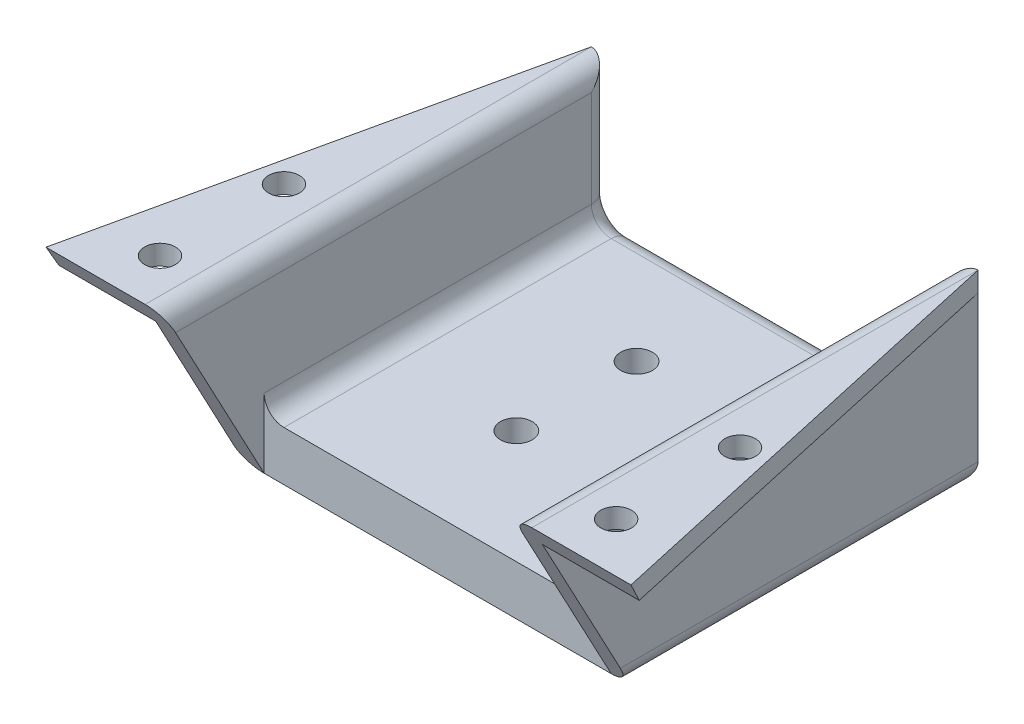
ISO-10303-21;
HEADER;
FILE_DESCRIPTION(('STEP AP214'),'2;1');
FILE_NAME('part.step','',(''),(''),'','','');
FILE_SCHEMA(('AUTOMOTIVE_DESIGN { 1 0 10303 214 1 1 1 1 }'));
ENDSEC;
DATA;
#1=APPLICATION_CONTEXT('core data for automotive mechanical design processes');
#2=APPLICATION_PROTOCOL_DEFINITION('international standard','automotive_design',2000,#1);
#3=PRODUCT_CONTEXT('',#1,'mechanical');
#4=PRODUCT('Part','Part','',(#3));
#5=PRODUCT_RELATED_PRODUCT_CATEGORY('part','',(#4));
#6=PRODUCT_DEFINITION_FORMATION('','',#4);
#7=PRODUCT_DEFINITION_CONTEXT('part definition',#1,'design');
#8=PRODUCT_DEFINITION('design','',#6,#7);
#9=PRODUCT_DEFINITION_SHAPE('','',#8);
#10=(LENGTH_UNIT() NAMED_UNIT(*) SI_UNIT(.MILLI.,.METRE.));
#11=(NAMED_UNIT(*) PLANE_ANGLE_UNIT() SI_UNIT($,.RADIAN.));
#12=(NAMED_UNIT(*) SI_UNIT($,.STERADIAN.) SOLID_ANGLE_UNIT());
#13=UNCERTAINTY_MEASURE_WITH_UNIT(LENGTH_MEASURE(1.E-05),#10,'distance_accuracy_value','');
#14=(GEOMETRIC_REPRESENTATION_CONTEXT(3) GLOBAL_UNCERTAINTY_ASSIGNED_CONTEXT((#13)) GLOBAL_UNIT_ASSIGNED_CONTEXT((#10,
#11,#12)) REPRESENTATION_CONTEXT('',''));
#15=CARTESIAN_POINT('',(0.,0.,0.));
#16=DIRECTION('',(0.,0.,1.));
#17=DIRECTION('',(1.,0.,0.));
#18=AXIS2_PLACEMENT_3D('',#15,#16,#17);
#19=CARTESIAN_POINT('',(-17.5,5.,-17.5));
#20=DIRECTION('',(0.,0.,1.));
#21=DIRECTION('',(1.,0.,0.));
#22=AXIS2_PLACEMENT_3D('',#19,#20,#21);
#23=PLANE('',#22);
#24=CARTESIAN_POINT('',(-15.5,7.,-17.5));
#25=DIRECTION('',(0.,0.,1.));
#26=DIRECTION('',(1.,0.,0.));
#27=AXIS2_PLACEMENT_3D('',#24,#25,#26);
#28=CIRCLE('',#27,4.);
#29=CARTESIAN_POINT('',(-15.5,3.,-17.5));
#30=VERTEX_POINT('',#29);
#31=CARTESIAN_POINT('',(-19.5,7.,-17.5));
#32=VERTEX_POINT('',#31);
#33=EDGE_CURVE('E250',#30,#32,#28,.F.);
#34=ORIENTED_EDGE('',*,*,#33,.F.);
#35=DIRECTION('',(-1.,0.,0.));
#36=VECTOR('',#35,1.);
#37=CARTESIAN_POINT('',(-17.5,3.,-17.5));
#38=LINE('',#37,#36);
#39=CARTESIAN_POINT('',(15.5,3.,-17.5));
#40=VERTEX_POINT('',#39);
#41=EDGE_CURVE('E248',#30,#40,#38,.F.);
#42=ORIENTED_EDGE('',*,*,#41,.T.);
#43=CARTESIAN_POINT('',(15.5,7.,-17.5));
#44=DIRECTION('',(0.,0.,1.));
#45=DIRECTION('',(1.,0.,0.));
#46=AXIS2_PLACEMENT_3D('',#43,#44,#45);
#47=CIRCLE('',#46,4.);
#48=CARTESIAN_POINT('',(19.5,7.,-17.5));
#49=VERTEX_POINT('',#48);
#50=EDGE_CURVE('E245',#49,#40,#47,.F.);
#51=ORIENTED_EDGE('',*,*,#50,.F.);
#52=DIRECTION('',(0.,1.,0.));
#53=VECTOR('',#52,1.);
#54=CARTESIAN_POINT('',(19.5,18.75,-17.5));
#55=LINE('',#54,#53);
#56=CARTESIAN_POINT('',(19.5,2.,-17.5));
#57=VERTEX_POINT('',#56);
#58=EDGE_CURVE('E202',#57,#49,#55,.T.);
#59=ORIENTED_EDGE('',*,*,#58,.F.);
#60=DIRECTION('',(-1.,0.,0.));
#61=VECTOR('',#60,1.);
#62=CARTESIAN_POINT('',(-19.5,2.,-17.5));
#63=LINE('',#62,#61);
#64=CARTESIAN_POINT('',(-19.5,2.,-17.5));
#65=VERTEX_POINT('',#64);
#66=EDGE_CURVE('E193',#57,#65,#63,.T.);
#67=ORIENTED_EDGE('',*,*,#66,.T.);
#68=DIRECTION('',(0.,1.,0.));
#69=VECTOR('',#68,1.);
#70=CARTESIAN_POINT('',(-19.5,18.75,-17.5));
#71=LINE('',#70,#69);
#72=EDGE_CURVE('E362',#65,#32,#71,.T.);
#73=ORIENTED_EDGE('',*,*,#72,.T.);
#74=EDGE_LOOP('',(#34,#42,#51,#59,#67,#73));
#75=FACE_BOUND('',#74,.T.);
#76=ADVANCED_FACE('F45',(#75),#23,.F.);
#77=CARTESIAN_POINT('',(0.,16.75,0.));
#78=DIRECTION('',(0.,-1.,0.));
#79=DIRECTION('',(0.,0.,-1.));
#80=AXIS2_PLACEMENT_3D('',#77,#78,#79);
#81=PLANE('',#80);
#82=CARTESIAN_POINT('',(23.,16.75,22.5));
#83=DIRECTION('',(0.,-1.,0.));
#84=DIRECTION('',(0.,0.,1.));
#85=AXIS2_PLACEMENT_3D('',#82,#83,#84);
#86=CIRCLE('',#85,1.55);
#87=CARTESIAN_POINT('',(23.,16.75,24.05));
#88=VERTEX_POINT('',#87);
#89=EDGE_CURVE('E425',#88,#88,#86,.T.);
#90=ORIENTED_EDGE('',*,*,#89,.F.);
#91=EDGE_LOOP('',(#90));
#92=FACE_BOUND('',#91,.T.);
#93=CARTESIAN_POINT('',(23.,16.75,10.));
#94=DIRECTION('',(0.,-1.,0.));
#95=DIRECTION('',(0.,0.,1.));
#96=AXIS2_PLACEMENT_3D('',#93,#94,#95);
#97=CIRCLE('',#96,1.55);
#98=CARTESIAN_POINT('',(23.,16.75,11.55));
#99=VERTEX_POINT('',#98);
#100=EDGE_CURVE('E430',#99,#99,#97,.T.);
#101=ORIENTED_EDGE('',*,*,#100,.F.);
#102=EDGE_LOOP('',(#101));
#103=FACE_BOUND('',#102,.T.);
#104=DIRECTION('',(0.216930457818656,0.,0.976187060183953));
#105=VECTOR('',#104,1.);
#106=CARTESIAN_POINT('',(29.5,16.75,27.5));
#107=LINE('',#106,#105);
#108=CARTESIAN_POINT('',(19.5,16.75,-17.5));
#109=VERTEX_POINT('',#108);
#110=CARTESIAN_POINT('',(29.262962962963,16.75,26.4333333333333));
#111=VERTEX_POINT('',#110);
#112=EDGE_CURVE('E176',#109,#111,#107,.T.);
#113=ORIENTED_EDGE('',*,*,#112,.T.);
#114=DIRECTION('',(-1.,0.,0.));
#115=VECTOR('',#114,1.);
#116=CARTESIAN_POINT('',(29.5,16.75,26.4333333333333));
#117=LINE('',#116,#115);
#118=CARTESIAN_POINT('',(19.5,16.75,26.4333333333333));
#119=VERTEX_POINT('',#118);
#120=EDGE_CURVE('E171',#111,#119,#117,.T.);
#121=ORIENTED_EDGE('',*,*,#120,.T.);
#122=DIRECTION('',(0.,0.,-1.));
#123=VECTOR('',#122,1.);
#124=CARTESIAN_POINT('',(19.5,16.75,-17.5));
#125=LINE('',#124,#123);
#126=EDGE_CURVE('E174',#119,#109,#125,.T.);
#127=ORIENTED_EDGE('',*,*,#126,.T.);
#128=EDGE_LOOP('',(#113,#121,#127));
#129=FACE_BOUND('',#128,.T.);
#130=ADVANCED_FACE('F173',(#92,#103,#129),#81,.T.);
#131=CARTESIAN_POINT('',(29.5,16.75,27.5));
#132=DIRECTION('',(-0.976187060183953,0.,0.216930457818656));
#133=DIRECTION('',(0.216930457818656,0.,0.976187060183953));
#134=AXIS2_PLACEMENT_3D('',#131,#132,#133);
#135=PLANE('',#134);
#136=DIRECTION('',(0.104007995922042,0.877567465592226,0.468035981649187));
#137=VECTOR('',#136,1.);
#138=CARTESIAN_POINT('',(29.3174519332347,17.2097506866681,26.6785336995563));
#139=LINE('',#138,#137);
#140=CARTESIAN_POINT('',(29.5,18.75,27.5));
#141=VERTEX_POINT('',#140);
#142=EDGE_CURVE('E181',#111,#141,#139,.T.);
#143=ORIENTED_EDGE('',*,*,#142,.F.);
#144=ORIENTED_EDGE('',*,*,#112,.F.);
#145=DIRECTION('',(0.,1.,0.));
#146=VECTOR('',#145,1.);
#147=CARTESIAN_POINT('',(19.5,16.75,-17.5));
#148=LINE('',#147,#146);
#149=CARTESIAN_POINT('',(19.5,18.75,-17.5));
#150=VERTEX_POINT('',#149);
#151=EDGE_CURVE('E419',#109,#150,#148,.T.);
#152=ORIENTED_EDGE('',*,*,#151,.T.);
#153=DIRECTION('',(0.216930457818656,0.,0.976187060183953));
#154=VECTOR('',#153,1.);
#155=CARTESIAN_POINT('',(29.5,18.75,27.5));
#156=LINE('',#155,#154);
#157=EDGE_CURVE('E422',#150,#141,#156,.T.);
#158=ORIENTED_EDGE('',*,*,#157,.T.);
#159=EDGE_LOOP('',(#143,#144,#152,#158));
#160=FACE_BOUND('',#159,.T.);
#161=ADVANCED_FACE('F439',(#160),#135,.F.);
#162=CARTESIAN_POINT('',(19.5,0.,0.));
#163=DIRECTION('',(-1.,0.,0.));
#164=DIRECTION('',(0.,0.,1.));
#165=AXIS2_PLACEMENT_3D('',#162,#163,#164);
#166=PLANE('',#165);
#167=DIRECTION('',(0.,-0.882352941176471,-0.470588235294118));
#168=VECTOR('',#167,1.);
#169=CARTESIAN_POINT('',(19.5,0.,17.5));
#170=LINE('',#169,#168);
#171=CARTESIAN_POINT('',(19.5,2.,18.5666666666667));
#172=VERTEX_POINT('',#171);
#173=EDGE_CURVE('E188',#119,#172,#170,.T.);
#174=ORIENTED_EDGE('',*,*,#173,.T.);
#175=DIRECTION('',(0.,0.,-1.));
#176=VECTOR('',#175,1.);
#177=CARTESIAN_POINT('',(19.5,2.,-17.5));
#178=LINE('',#177,#176);
#179=EDGE_CURVE('E289',#172,#57,#178,.T.);
#180=ORIENTED_EDGE('',*,*,#179,.T.);
#181=ORIENTED_EDGE('',*,*,#58,.T.);
#182=EDGE_CURVE('E192',#49,#109,#55,.T.);
#183=ORIENTED_EDGE('',*,*,#182,.T.);
#184=ORIENTED_EDGE('',*,*,#126,.F.);
#185=EDGE_LOOP('',(#174,#180,#181,#183,#184));
#186=FACE_BOUND('',#185,.T.);
#187=ADVANCED_FACE('F187',(#186),#166,.F.);
#188=CARTESIAN_POINT('',(0.,5.,0.));
#189=DIRECTION('',(0.,-1.,0.));
#190=DIRECTION('',(0.,0.,-1.));
#191=AXIS2_PLACEMENT_3D('',#188,#189,#190);
#192=PLANE('',#191);
#193=DIRECTION('',(1.,0.,0.));
#194=VECTOR('',#193,1.);
#195=CARTESIAN_POINT('',(-17.5,5.,17.5));
#196=LINE('',#195,#194);
#197=CARTESIAN_POINT('',(-15.5,5.,17.5));
#198=VERTEX_POINT('',#197);
#199=CARTESIAN_POINT('',(15.5,5.,17.5));
#200=VERTEX_POINT('',#199);
#201=EDGE_CURVE('E230',#198,#200,#196,.T.);
#202=ORIENTED_EDGE('',*,*,#201,.T.);
#203=DIRECTION('',(0.,0.,-1.));
#204=VECTOR('',#203,1.);
#205=CARTESIAN_POINT('',(15.5,5.,0.));
#206=LINE('',#205,#204);
#207=CARTESIAN_POINT('',(15.5,5.,-15.5));
#208=VERTEX_POINT('',#207);
#209=EDGE_CURVE('E281',#200,#208,#206,.T.);
#210=ORIENTED_EDGE('',*,*,#209,.T.);
#211=DIRECTION('',(-1.,0.,0.));
#212=VECTOR('',#211,1.);
#213=CARTESIAN_POINT('',(0.,5.,-15.5));
#214=LINE('',#213,#212);
#215=CARTESIAN_POINT('',(-15.5,5.,-15.5));
#216=VERTEX_POINT('',#215);
#217=EDGE_CURVE('E279',#208,#216,#214,.T.);
#218=ORIENTED_EDGE('',*,*,#217,.T.);
#219=DIRECTION('',(0.,0.,1.));
#220=VECTOR('',#219,1.);
#221=CARTESIAN_POINT('',(-15.5,5.,0.));
#222=LINE('',#221,#220);
#223=EDGE_CURVE('E277',#216,#198,#222,.T.);
#224=ORIENTED_EDGE('',*,*,#223,.T.);
#225=EDGE_LOOP('',(#202,#210,#218,#224));
#226=FACE_BOUND('',#225,.T.);
#227=CARTESIAN_POINT('',(7.,5.,0.));
#228=DIRECTION('',(0.,1.,0.));
#229=DIRECTION('',(0.,0.,1.));
#230=AXIS2_PLACEMENT_3D('',#227,#228,#229);
#231=CIRCLE('',#230,1.6);
#232=CARTESIAN_POINT('',(7.,5.,1.6));
#233=VERTEX_POINT('',#232);
#234=EDGE_CURVE('E224',#233,#233,#231,.T.);
#235=ORIENTED_EDGE('',*,*,#234,.F.);
#236=EDGE_LOOP('',(#235));
#237=FACE_BOUND('',#236,.T.);
#238=CARTESIAN_POINT('',(-3.5,5.,6.06217782649107));
#239=DIRECTION('',(0.,1.,0.));
#240=DIRECTION('',(0.,0.,1.));
#241=AXIS2_PLACEMENT_3D('',#238,#239,#240);
#242=CIRCLE('',#241,1.6);
#243=CARTESIAN_POINT('',(-3.5,5.,7.66217782649107));
#244=VERTEX_POINT('',#243);
#245=EDGE_CURVE('E218',#244,#244,#242,.T.);
#246=ORIENTED_EDGE('',*,*,#245,.F.);
#247=EDGE_LOOP('',(#246));
#248=FACE_BOUND('',#247,.T.);
#249=CARTESIAN_POINT('',(-3.5,5.,-6.06217782649107));
#250=DIRECTION('',(0.,1.,0.));
#251=DIRECTION('',(0.,0.,1.));
#252=AXIS2_PLACEMENT_3D('',#249,#250,#251);
#253=CIRCLE('',#252,1.6);
#254=CARTESIAN_POINT('',(-3.5,5.,-4.46217782649107));
#255=VERTEX_POINT('',#254);
#256=EDGE_CURVE('E212',#255,#255,#253,.T.);
#257=ORIENTED_EDGE('',*,*,#256,.F.);
#258=EDGE_LOOP('',(#257));
#259=FACE_BOUND('',#258,.T.);
#260=ADVANCED_FACE('F342',(#226,#237,#248,#259),#192,.F.);
#261=CARTESIAN_POINT('',(0.,0.,0.));
#262=DIRECTION('',(0.,-1.,0.));
#263=DIRECTION('',(0.,0.,-1.));
#264=AXIS2_PLACEMENT_3D('',#261,#262,#263);
#265=PLANE('',#264);
#266=CARTESIAN_POINT('',(-3.5,0.,6.06217782649107));
#267=DIRECTION('',(0.,1.,0.));
#268=DIRECTION('',(0.,0.,1.));
#269=AXIS2_PLACEMENT_3D('',#266,#267,#268);
#270=CIRCLE('',#269,1.6);
#271=CARTESIAN_POINT('',(-3.5,0.,7.66217782649107));
#272=VERTEX_POINT('',#271);
#273=EDGE_CURVE('E215',#272,#272,#270,.T.);
#274=ORIENTED_EDGE('',*,*,#273,.T.);
#275=EDGE_LOOP('',(#274));
#276=FACE_BOUND('',#275,.T.);
#277=DIRECTION('',(1.,0.,0.));
#278=VECTOR('',#277,1.);
#279=CARTESIAN_POINT('',(-17.5,0.,17.5));
#280=LINE('',#279,#278);
#281=CARTESIAN_POINT('',(-17.5,0.,17.5));
#282=VERTEX_POINT('',#281);
#283=CARTESIAN_POINT('',(17.5,0.,17.5));
#284=VERTEX_POINT('',#283);
#285=EDGE_CURVE('E227',#282,#284,#280,.T.);
#286=ORIENTED_EDGE('',*,*,#285,.F.);
#287=DIRECTION('',(0.,0.,-1.));
#288=VECTOR('',#287,1.);
#289=CARTESIAN_POINT('',(-17.5,0.,-17.5));
#290=LINE('',#289,#288);
#291=CARTESIAN_POINT('',(-17.5,0.,-15.5));
#292=VERTEX_POINT('',#291);
#293=EDGE_CURVE('E62',#282,#292,#290,.T.);
#294=ORIENTED_EDGE('',*,*,#293,.T.);
#295=DIRECTION('',(-1.,0.,0.));
#296=VECTOR('',#295,1.);
#297=CARTESIAN_POINT('',(19.5,0.,-15.5));
#298=LINE('',#297,#296);
#299=CARTESIAN_POINT('',(17.5,0.,-15.5));
#300=VERTEX_POINT('',#299);
#301=EDGE_CURVE('E66',#292,#300,#298,.F.);
#302=ORIENTED_EDGE('',*,*,#301,.T.);
#303=DIRECTION('',(0.,0.,-1.));
#304=VECTOR('',#303,1.);
#305=CARTESIAN_POINT('',(17.5,0.,17.5));
#306=LINE('',#305,#304);
#307=EDGE_CURVE('E283',#300,#284,#306,.F.);
#308=ORIENTED_EDGE('',*,*,#307,.T.);
#309=EDGE_LOOP('',(#286,#294,#302,#308));
#310=FACE_BOUND('',#309,.T.);
#311=CARTESIAN_POINT('',(7.,0.,0.));
#312=DIRECTION('',(0.,1.,0.));
#313=DIRECTION('',(0.,0.,1.));
#314=AXIS2_PLACEMENT_3D('',#311,#312,#313);
#315=CIRCLE('',#314,1.6);
#316=CARTESIAN_POINT('',(7.,0.,1.6));
#317=VERTEX_POINT('',#316);
#318=EDGE_CURVE('E221',#317,#317,#315,.T.);
#319=ORIENTED_EDGE('',*,*,#318,.T.);
#320=EDGE_LOOP('',(#319));
#321=FACE_BOUND('',#320,.T.);
#322=CARTESIAN_POINT('',(-3.5,0.,-6.06217782649107));
#323=DIRECTION('',(0.,1.,0.));
#324=DIRECTION('',(0.,0.,1.));
#325=AXIS2_PLACEMENT_3D('',#322,#323,#324);
#326=CIRCLE('',#325,1.6);
#327=CARTESIAN_POINT('',(-3.5,0.,-4.46217782649107));
#328=VERTEX_POINT('',#327);
#329=EDGE_CURVE('E204',#328,#328,#326,.T.);
#330=ORIENTED_EDGE('',*,*,#329,.T.);
#331=EDGE_LOOP('',(#330));
#332=FACE_BOUND('',#331,.T.);
#333=ADVANCED_FACE('F323',(#276,#310,#321,#332),#265,.T.);
#334=CARTESIAN_POINT('',(-17.5,5.,17.5));
#335=DIRECTION('',(0.,0.,-1.));
#336=DIRECTION('',(-1.,0.,0.));
#337=AXIS2_PLACEMENT_3D('',#334,#335,#336);
#338=PLANE('',#337);
#339=ORIENTED_EDGE('',*,*,#285,.T.);
#340=DIRECTION('',(0.,-1.,0.));
#341=VECTOR('',#340,1.);
#342=CARTESIAN_POINT('',(17.5,5.,17.5));
#343=LINE('',#342,#341);
#344=CARTESIAN_POINT('',(17.5,7.,17.5));
#345=VERTEX_POINT('',#344);
#346=EDGE_CURVE('E233',#345,#284,#343,.T.);
#347=ORIENTED_EDGE('',*,*,#346,.F.);
#348=CARTESIAN_POINT('',(15.5,7.,17.5));
#349=DIRECTION('',(0.,0.,-1.));
#350=DIRECTION('',(-1.,0.,0.));
#351=AXIS2_PLACEMENT_3D('',#348,#349,#350);
#352=CIRCLE('',#351,2.);
#353=EDGE_CURVE('E54',#345,#200,#352,.T.);
#354=ORIENTED_EDGE('',*,*,#353,.T.);
#355=ORIENTED_EDGE('',*,*,#201,.F.);
#356=CARTESIAN_POINT('',(-15.5,7.,17.5));
#357=DIRECTION('',(0.,0.,-1.));
#358=DIRECTION('',(-1.,0.,0.));
#359=AXIS2_PLACEMENT_3D('',#356,#357,#358);
#360=CIRCLE('',#359,2.);
#361=CARTESIAN_POINT('',(-17.5,7.,17.5));
#362=VERTEX_POINT('',#361);
#363=EDGE_CURVE('E11',#198,#362,#360,.T.);
#364=ORIENTED_EDGE('',*,*,#363,.T.);
#365=DIRECTION('',(0.,-1.,0.));
#366=VECTOR('',#365,1.);
#367=CARTESIAN_POINT('',(-17.5,5.,17.5));
#368=LINE('',#367,#366);
#369=EDGE_CURVE('E238',#362,#282,#368,.T.);
#370=ORIENTED_EDGE('',*,*,#369,.T.);
#371=EDGE_LOOP('',(#339,#347,#354,#355,#364,#370));
#372=FACE_BOUND('',#371,.T.);
#373=ADVANCED_FACE('F330',(#372),#338,.F.);
#374=CARTESIAN_POINT('',(7.,5.,0.));
#375=DIRECTION('',(0.,-1.,0.));
#376=DIRECTION('',(0.,0.,-1.));
#377=AXIS2_PLACEMENT_3D('',#374,#375,#376);
#378=CYLINDRICAL_SURFACE('',#377,1.6);
#379=ORIENTED_EDGE('',*,*,#234,.T.);
#380=EDGE_LOOP('',(#379));
#381=FACE_BOUND('',#380,.T.);
#382=ORIENTED_EDGE('',*,*,#318,.F.);
#383=EDGE_LOOP('',(#382));
#384=FACE_BOUND('',#383,.T.);
#385=ADVANCED_FACE('F653',(#381,#384),#378,.F.);
#386=CARTESIAN_POINT('',(-3.5,5.,6.06217782649107));
#387=DIRECTION('',(0.,-1.,0.));
#388=DIRECTION('',(0.,0.,-1.));
#389=AXIS2_PLACEMENT_3D('',#386,#387,#388);
#390=CYLINDRICAL_SURFACE('',#389,1.6);
#391=ORIENTED_EDGE('',*,*,#245,.T.);
#392=EDGE_LOOP('',(#391));
#393=FACE_BOUND('',#392,.T.);
#394=ORIENTED_EDGE('',*,*,#273,.F.);
#395=EDGE_LOOP('',(#394));
#396=FACE_BOUND('',#395,.T.);
#397=ADVANCED_FACE('F723',(#393,#396),#390,.F.);
#398=CARTESIAN_POINT('',(-3.5,5.,-6.06217782649107));
#399=DIRECTION('',(0.,-1.,0.));
#400=DIRECTION('',(0.,0.,-1.));
#401=AXIS2_PLACEMENT_3D('',#398,#399,#400);
#402=CYLINDRICAL_SURFACE('',#401,1.6);
#403=ORIENTED_EDGE('',*,*,#256,.T.);
#404=EDGE_LOOP('',(#403));
#405=FACE_BOUND('',#404,.T.);
#406=ORIENTED_EDGE('',*,*,#329,.F.);
#407=EDGE_LOOP('',(#406));
#408=FACE_BOUND('',#407,.T.);
#409=ADVANCED_FACE('F644',(#405,#408),#402,.F.);
#410=CARTESIAN_POINT('',(17.5,0.,0.));
#411=DIRECTION('',(-1.,0.,0.));
#412=DIRECTION('',(0.,0.,1.));
#413=AXIS2_PLACEMENT_3D('',#410,#411,#412);
#414=PLANE('',#413);
#415=DIRECTION('',(0.,-0.882352941176471,-0.470588235294118));
#416=VECTOR('',#415,1.);
#417=CARTESIAN_POINT('',(17.5,0.,17.5));
#418=LINE('',#417,#416);
#419=CARTESIAN_POINT('',(17.5,16.75,26.4333333333333));
#420=VERTEX_POINT('',#419);
#421=EDGE_CURVE('E209',#420,#284,#418,.T.);
#422=ORIENTED_EDGE('',*,*,#421,.F.);
#423=DIRECTION('',(0.,0.,1.));
#424=VECTOR('',#423,1.);
#425=CARTESIAN_POINT('',(17.5,16.75,-17.5));
#426=LINE('',#425,#424);
#427=CARTESIAN_POINT('',(17.5,16.75,-15.5));
#428=VERTEX_POINT('',#427);
#429=EDGE_CURVE('E258',#420,#428,#426,.F.);
#430=ORIENTED_EDGE('',*,*,#429,.T.);
#431=DIRECTION('',(0.,1.,0.));
#432=VECTOR('',#431,1.);
#433=CARTESIAN_POINT('',(17.5,5.,-15.5));
#434=LINE('',#433,#432);
#435=CARTESIAN_POINT('',(17.5,7.,-15.5));
#436=VERTEX_POINT('',#435);
#437=EDGE_CURVE('E256',#428,#436,#434,.F.);
#438=ORIENTED_EDGE('',*,*,#437,.T.);
#439=DIRECTION('',(0.,0.,-1.));
#440=VECTOR('',#439,1.);
#441=CARTESIAN_POINT('',(17.5,7.,0.));
#442=LINE('',#441,#440);
#443=EDGE_CURVE('E253',#436,#345,#442,.F.);
#444=ORIENTED_EDGE('',*,*,#443,.T.);
#445=ORIENTED_EDGE('',*,*,#346,.T.);
#446=EDGE_LOOP('',(#422,#430,#438,#444,#445));
#447=FACE_BOUND('',#446,.T.);
#448=ADVANCED_FACE('F331',(#447),#414,.T.);
#449=CARTESIAN_POINT('',(19.5,18.75,27.5));
#450=DIRECTION('',(0.,-1.,0.));
#451=DIRECTION('',(0.,0.,-1.));
#452=AXIS2_PLACEMENT_3D('',#449,#450,#451);
#453=PLANE('',#452);
#454=ORIENTED_EDGE('',*,*,#157,.F.);
#455=DIRECTION('',(0.,0.,1.));
#456=VECTOR('',#455,1.);
#457=CARTESIAN_POINT('',(19.5,18.75,27.5));
#458=LINE('',#457,#456);
#459=CARTESIAN_POINT('',(19.5,18.75,27.5));
#460=VERTEX_POINT('',#459);
#461=EDGE_CURVE('E272',#150,#460,#458,.T.);
#462=ORIENTED_EDGE('',*,*,#461,.T.);
#463=DIRECTION('',(-1.,0.,0.));
#464=VECTOR('',#463,1.);
#465=CARTESIAN_POINT('',(19.5,18.75,27.5));
#466=LINE('',#465,#464);
#467=EDGE_CURVE('E201',#141,#460,#466,.T.);
#468=ORIENTED_EDGE('',*,*,#467,.F.);
#469=EDGE_LOOP('',(#454,#462,#468));
#470=FACE_BOUND('',#469,.T.);
#471=CARTESIAN_POINT('',(23.,18.75,22.5));
#472=DIRECTION('',(0.,-1.,0.));
#473=DIRECTION('',(0.,0.,1.));
#474=AXIS2_PLACEMENT_3D('',#471,#472,#473);
#475=CIRCLE('',#474,1.55);
#476=CARTESIAN_POINT('',(23.,18.75,24.05));
#477=VERTEX_POINT('',#476);
#478=EDGE_CURVE('E427',#477,#477,#475,.T.);
#479=ORIENTED_EDGE('',*,*,#478,.T.);
#480=EDGE_LOOP('',(#479));
#481=FACE_BOUND('',#480,.T.);
#482=CARTESIAN_POINT('',(23.,18.75,10.));
#483=DIRECTION('',(0.,-1.,0.));
#484=DIRECTION('',(0.,0.,1.));
#485=AXIS2_PLACEMENT_3D('',#482,#483,#484);
#486=CIRCLE('',#485,1.55);
#487=CARTESIAN_POINT('',(23.,18.75,11.55));
#488=VERTEX_POINT('',#487);
#489=EDGE_CURVE('E433',#488,#488,#486,.T.);
#490=ORIENTED_EDGE('',*,*,#489,.T.);
#491=EDGE_LOOP('',(#490));
#492=FACE_BOUND('',#491,.T.);
#493=ADVANCED_FACE('F442',(#470,#481,#492),#453,.F.);
#494=CARTESIAN_POINT('',(19.5,0.,17.5));
#495=DIRECTION('',(0.,0.470588235294118,-0.882352941176471));
#496=DIRECTION('',(0.,0.882352941176471,0.470588235294118));
#497=AXIS2_PLACEMENT_3D('',#494,#495,#496);
#498=PLANE('',#497);
#499=ORIENTED_EDGE('',*,*,#467,.T.);
#500=CARTESIAN_POINT('',(19.5,16.75,26.4333333333333));
#501=DIRECTION('',(0.,0.470588235294118,-0.882352941176471));
#502=DIRECTION('',(0.,-0.882352941176471,-0.470588235294118));
#503=AXIS2_PLACEMENT_3D('',#500,#501,#502);
#504=ELLIPSE('',#503,2.26666666666667,2.);
#505=EDGE_CURVE('E275',#460,#420,#504,.F.);
#506=ORIENTED_EDGE('',*,*,#505,.T.);
#507=ORIENTED_EDGE('',*,*,#421,.T.);
#508=CARTESIAN_POINT('',(17.5,2.,18.5666666666667));
#509=DIRECTION('',(0.,0.470588235294118,-0.882352941176471));
#510=DIRECTION('',(0.,0.882352941176471,0.470588235294118));
#511=AXIS2_PLACEMENT_3D('',#508,#509,#510);
#512=ELLIPSE('',#511,2.26666666666667,2.);
#513=EDGE_CURVE('E200',#284,#172,#512,.F.);
#514=ORIENTED_EDGE('',*,*,#513,.T.);
#515=ORIENTED_EDGE('',*,*,#173,.F.);
#516=ORIENTED_EDGE('',*,*,#120,.F.);
#517=ORIENTED_EDGE('',*,*,#142,.T.);
#518=EDGE_LOOP('',(#499,#506,#507,#514,#515,#516,#517));
#519=FACE_BOUND('',#518,.T.);
#520=ADVANCED_FACE('F197',(#519),#498,.F.);
#521=CARTESIAN_POINT('',(-17.5,0.,0.));
#522=DIRECTION('',(1.,0.,0.));
#523=DIRECTION('',(0.,0.,1.));
#524=AXIS2_PLACEMENT_3D('',#521,#522,#523);
#525=PLANE('',#524);
#526=DIRECTION('',(0.,1.,0.));
#527=VECTOR('',#526,1.);
#528=CARTESIAN_POINT('',(-17.5,18.75,-15.5));
#529=LINE('',#528,#527);
#530=CARTESIAN_POINT('',(-17.5,7.,-15.5));
#531=VERTEX_POINT('',#530);
#532=CARTESIAN_POINT('',(-17.5,16.75,-15.5));
#533=VERTEX_POINT('',#532);
#534=EDGE_CURVE('E262',#531,#533,#529,.T.);
#535=ORIENTED_EDGE('',*,*,#534,.T.);
#536=DIRECTION('',(0.,0.,1.));
#537=VECTOR('',#536,1.);
#538=CARTESIAN_POINT('',(-17.5,16.75,0.));
#539=LINE('',#538,#537);
#540=CARTESIAN_POINT('',(-17.5,16.75,26.4333333333333));
#541=VERTEX_POINT('',#540);
#542=EDGE_CURVE('E264',#533,#541,#539,.T.);
#543=ORIENTED_EDGE('',*,*,#542,.T.);
#544=DIRECTION('',(0.,-0.882352941176471,-0.470588235294118));
#545=VECTOR('',#544,1.);
#546=CARTESIAN_POINT('',(-17.5,0.,17.5));
#547=LINE('',#546,#545);
#548=EDGE_CURVE('E385',#541,#282,#547,.T.);
#549=ORIENTED_EDGE('',*,*,#548,.T.);
#550=ORIENTED_EDGE('',*,*,#369,.F.);
#551=DIRECTION('',(0.,0.,1.));
#552=VECTOR('',#551,1.);
#553=CARTESIAN_POINT('',(-17.5,7.,0.));
#554=LINE('',#553,#552);
#555=EDGE_CURVE('E260',#362,#531,#554,.F.);
#556=ORIENTED_EDGE('',*,*,#555,.T.);
#557=EDGE_LOOP('',(#535,#543,#549,#550,#556));
#558=FACE_BOUND('',#557,.T.);
#559=ADVANCED_FACE('F374',(#558),#525,.T.);
#560=CARTESIAN_POINT('',(-19.5,0.,17.5));
#561=DIRECTION('',(0.,-0.470588235294118,0.882352941176471));
#562=DIRECTION('',(0.,-0.882352941176471,-0.470588235294118));
#563=AXIS2_PLACEMENT_3D('',#560,#561,#562);
#564=PLANE('',#563);
#565=ORIENTED_EDGE('',*,*,#548,.F.);
#566=CARTESIAN_POINT('',(-19.5,16.75,26.4333333333333));
#567=DIRECTION('',(0.,-0.470588235294118,0.882352941176471));
#568=DIRECTION('',(0.,0.882352941176471,0.470588235294118));
#569=AXIS2_PLACEMENT_3D('',#566,#567,#568);
#570=ELLIPSE('',#569,2.26666666666667,2.);
#571=CARTESIAN_POINT('',(-19.5,18.75,27.5));
#572=VERTEX_POINT('',#571);
#573=EDGE_CURVE('E268',#541,#572,#570,.T.);
#574=ORIENTED_EDGE('',*,*,#573,.T.);
#575=DIRECTION('',(1.,0.,0.));
#576=VECTOR('',#575,1.);
#577=CARTESIAN_POINT('',(-19.5,18.75,27.5));
#578=LINE('',#577,#576);
#579=CARTESIAN_POINT('',(-29.5,18.75,27.5));
#580=VERTEX_POINT('',#579);
#581=EDGE_CURVE('E210',#580,#572,#578,.T.);
#582=ORIENTED_EDGE('',*,*,#581,.F.);
#583=DIRECTION('',(0.104007995922042,-0.877567465592226,-0.468035981649187));
#584=VECTOR('',#583,1.);
#585=CARTESIAN_POINT('',(-29.3174519332347,17.2097506866681,26.6785336995563));
#586=LINE('',#585,#584);
#587=CARTESIAN_POINT('',(-29.262962962963,16.75,26.4333333333333));
#588=VERTEX_POINT('',#587);
#589=EDGE_CURVE('E415',#580,#588,#586,.T.);
#590=ORIENTED_EDGE('',*,*,#589,.T.);
#591=DIRECTION('',(1.,0.,0.));
#592=VECTOR('',#591,1.);
#593=CARTESIAN_POINT('',(0.,16.75,26.4333333333333));
#594=LINE('',#593,#592);
#595=CARTESIAN_POINT('',(-19.5,16.75,26.4333333333333));
#596=VERTEX_POINT('',#595);
#597=EDGE_CURVE('E194',#588,#596,#594,.T.);
#598=ORIENTED_EDGE('',*,*,#597,.T.);
#599=DIRECTION('',(0.,-0.882352941176471,-0.470588235294118));
#600=VECTOR('',#599,1.);
#601=CARTESIAN_POINT('',(-19.5,0.,17.5));
#602=LINE('',#601,#600);
#603=CARTESIAN_POINT('',(-19.5,2.,18.5666666666667));
#604=VERTEX_POINT('',#603);
#605=EDGE_CURVE('E393',#596,#604,#602,.T.);
#606=ORIENTED_EDGE('',*,*,#605,.T.);
#607=CARTESIAN_POINT('',(-17.5,2.,18.5666666666667));
#608=DIRECTION('',(0.,-0.470588235294118,0.882352941176471));
#609=DIRECTION('',(0.,0.882352941176471,0.470588235294118));
#610=AXIS2_PLACEMENT_3D('',#607,#608,#609);
#611=ELLIPSE('',#610,2.26666666666667,2.);
#612=EDGE_CURVE('E266',#604,#282,#611,.T.);
#613=ORIENTED_EDGE('',*,*,#612,.T.);
#614=EDGE_LOOP('',(#565,#574,#582,#590,#598,#606,#613));
#615=FACE_BOUND('',#614,.T.);
#616=ADVANCED_FACE('F383',(#615),#564,.T.);
#617=CARTESIAN_POINT('',(-19.5,18.75,27.5));
#618=DIRECTION('',(0.,1.,0.));
#619=DIRECTION('',(0.,0.,1.));
#620=AXIS2_PLACEMENT_3D('',#617,#618,#619);
#621=PLANE('',#620);
#622=ORIENTED_EDGE('',*,*,#581,.T.);
#623=DIRECTION('',(0.,0.,1.));
#624=VECTOR('',#623,1.);
#625=CARTESIAN_POINT('',(-19.5,18.75,27.5));
#626=LINE('',#625,#624);
#627=CARTESIAN_POINT('',(-19.5,18.75,-17.5));
#628=VERTEX_POINT('',#627);
#629=EDGE_CURVE('E270',#572,#628,#626,.F.);
#630=ORIENTED_EDGE('',*,*,#629,.T.);
#631=DIRECTION('',(-0.216930457818656,0.,0.976187060183953));
#632=VECTOR('',#631,1.);
#633=CARTESIAN_POINT('',(-29.5,18.75,27.5));
#634=LINE('',#633,#632);
#635=EDGE_CURVE('E391',#628,#580,#634,.T.);
#636=ORIENTED_EDGE('',*,*,#635,.T.);
#637=EDGE_LOOP('',(#622,#630,#636));
#638=FACE_BOUND('',#637,.T.);
#639=CARTESIAN_POINT('',(-23.,18.75,10.));
#640=DIRECTION('',(0.,1.,0.));
#641=DIRECTION('',(0.,0.,1.));
#642=AXIS2_PLACEMENT_3D('',#639,#640,#641);
#643=CIRCLE('',#642,1.55);
#644=CARTESIAN_POINT('',(-23.,18.75,11.55));
#645=VERTEX_POINT('',#644);
#646=EDGE_CURVE('E412',#645,#645,#643,.T.);
#647=ORIENTED_EDGE('',*,*,#646,.F.);
#648=EDGE_LOOP('',(#647));
#649=FACE_BOUND('',#648,.T.);
#650=CARTESIAN_POINT('',(-23.,18.75,22.5));
#651=DIRECTION('',(0.,1.,0.));
#652=DIRECTION('',(0.,0.,1.));
#653=AXIS2_PLACEMENT_3D('',#650,#651,#652);
#654=CIRCLE('',#653,1.55);
#655=CARTESIAN_POINT('',(-23.,18.75,24.05));
#656=VERTEX_POINT('',#655);
#657=EDGE_CURVE('E406',#656,#656,#654,.T.);
#658=ORIENTED_EDGE('',*,*,#657,.F.);
#659=EDGE_LOOP('',(#658));
#660=FACE_BOUND('',#659,.T.);
#661=ADVANCED_FACE('F388',(#638,#649,#660),#621,.T.);
#662=CARTESIAN_POINT('',(-19.5,0.,0.));
#663=DIRECTION('',(1.,0.,0.));
#664=DIRECTION('',(0.,0.,1.));
#665=AXIS2_PLACEMENT_3D('',#662,#663,#664);
#666=PLANE('',#665);
#667=ORIENTED_EDGE('',*,*,#72,.F.);
#668=DIRECTION('',(0.,0.,-1.));
#669=VECTOR('',#668,1.);
#670=CARTESIAN_POINT('',(-19.5,2.,17.5));
#671=LINE('',#670,#669);
#672=EDGE_CURVE('E287',#65,#604,#671,.F.);
#673=ORIENTED_EDGE('',*,*,#672,.T.);
#674=ORIENTED_EDGE('',*,*,#605,.F.);
#675=DIRECTION('',(0.,0.,-1.));
#676=VECTOR('',#675,1.);
#677=CARTESIAN_POINT('',(-19.5,16.75,-17.5));
#678=LINE('',#677,#676);
#679=CARTESIAN_POINT('',(-19.5,16.75,-17.5));
#680=VERTEX_POINT('',#679);
#681=EDGE_CURVE('E241',#596,#680,#678,.T.);
#682=ORIENTED_EDGE('',*,*,#681,.T.);
#683=EDGE_CURVE('E364',#32,#680,#71,.T.);
#684=ORIENTED_EDGE('',*,*,#683,.F.);
#685=EDGE_LOOP('',(#667,#673,#674,#682,#684));
#686=FACE_BOUND('',#685,.T.);
#687=ADVANCED_FACE('F587',(#686),#666,.F.);
#688=CARTESIAN_POINT('',(-29.5,16.75,27.5));
#689=DIRECTION('',(-0.976187060183953,0.,-0.216930457818656));
#690=DIRECTION('',(-0.216930457818656,0.,0.976187060183953));
#691=AXIS2_PLACEMENT_3D('',#688,#689,#690);
#692=PLANE('',#691);
#693=ORIENTED_EDGE('',*,*,#589,.F.);
#694=ORIENTED_EDGE('',*,*,#635,.F.);
#695=DIRECTION('',(0.,1.,0.));
#696=VECTOR('',#695,1.);
#697=CARTESIAN_POINT('',(-19.5,16.75,-17.5));
#698=LINE('',#697,#696);
#699=EDGE_CURVE('E394',#680,#628,#698,.T.);
#700=ORIENTED_EDGE('',*,*,#699,.F.);
#701=DIRECTION('',(-0.216930457818656,0.,0.976187060183953));
#702=VECTOR('',#701,1.);
#703=CARTESIAN_POINT('',(-29.5,16.75,27.5));
#704=LINE('',#703,#702);
#705=EDGE_CURVE('E399',#680,#588,#704,.T.);
#706=ORIENTED_EDGE('',*,*,#705,.T.);
#707=EDGE_LOOP('',(#693,#694,#700,#706));
#708=FACE_BOUND('',#707,.T.);
#709=ADVANCED_FACE('F577',(#708),#692,.T.);
#710=CARTESIAN_POINT('',(0.,16.75,0.));
#711=DIRECTION('',(0.,-1.,0.));
#712=DIRECTION('',(0.,0.,-1.));
#713=AXIS2_PLACEMENT_3D('',#710,#711,#712);
#714=PLANE('',#713);
#715=ORIENTED_EDGE('',*,*,#597,.F.);
#716=ORIENTED_EDGE('',*,*,#705,.F.);
#717=ORIENTED_EDGE('',*,*,#681,.F.);
#718=EDGE_LOOP('',(#715,#716,#717));
#719=FACE_BOUND('',#718,.T.);
#720=CARTESIAN_POINT('',(-23.,16.75,10.));
#721=DIRECTION('',(0.,1.,0.));
#722=DIRECTION('',(0.,0.,1.));
#723=AXIS2_PLACEMENT_3D('',#720,#721,#722);
#724=CIRCLE('',#723,1.55);
#725=CARTESIAN_POINT('',(-23.,16.75,11.55));
#726=VERTEX_POINT('',#725);
#727=EDGE_CURVE('E409',#726,#726,#724,.T.);
#728=ORIENTED_EDGE('',*,*,#727,.T.);
#729=EDGE_LOOP('',(#728));
#730=FACE_BOUND('',#729,.T.);
#731=CARTESIAN_POINT('',(-23.,16.75,22.5));
#732=DIRECTION('',(0.,1.,0.));
#733=DIRECTION('',(0.,0.,1.));
#734=AXIS2_PLACEMENT_3D('',#731,#732,#733);
#735=CIRCLE('',#734,1.55);
#736=CARTESIAN_POINT('',(-23.,16.75,24.05));
#737=VERTEX_POINT('',#736);
#738=EDGE_CURVE('E401',#737,#737,#735,.T.);
#739=ORIENTED_EDGE('',*,*,#738,.T.);
#740=EDGE_LOOP('',(#739));
#741=FACE_BOUND('',#740,.T.);
#742=ADVANCED_FACE('F572',(#719,#730,#741),#714,.T.);
#743=CARTESIAN_POINT('',(-23.,16.75,22.5));
#744=DIRECTION('',(0.,1.,0.));
#745=DIRECTION('',(0.,0.,1.));
#746=AXIS2_PLACEMENT_3D('',#743,#744,#745);
#747=CYLINDRICAL_SURFACE('',#746,1.55);
#748=ORIENTED_EDGE('',*,*,#738,.F.);
#749=EDGE_LOOP('',(#748));
#750=FACE_BOUND('',#749,.T.);
#751=ORIENTED_EDGE('',*,*,#657,.T.);
#752=EDGE_LOOP('',(#751));
#753=FACE_BOUND('',#752,.T.);
#754=ADVANCED_FACE('F576',(#750,#753),#747,.F.);
#755=CARTESIAN_POINT('',(-23.,16.75,10.));
#756=DIRECTION('',(0.,1.,0.));
#757=DIRECTION('',(0.,0.,1.));
#758=AXIS2_PLACEMENT_3D('',#755,#756,#757);
#759=CYLINDRICAL_SURFACE('',#758,1.55);
#760=ORIENTED_EDGE('',*,*,#727,.F.);
#761=EDGE_LOOP('',(#760));
#762=FACE_BOUND('',#761,.T.);
#763=ORIENTED_EDGE('',*,*,#646,.T.);
#764=EDGE_LOOP('',(#763));
#765=FACE_BOUND('',#764,.T.);
#766=ADVANCED_FACE('F701',(#762,#765),#759,.F.);
#767=CARTESIAN_POINT('',(23.,16.75,22.5));
#768=DIRECTION('',(0.,1.,0.));
#769=DIRECTION('',(0.,0.,1.));
#770=AXIS2_PLACEMENT_3D('',#767,#768,#769);
#771=CYLINDRICAL_SURFACE('',#770,1.55);
#772=ORIENTED_EDGE('',*,*,#89,.T.);
#773=EDGE_LOOP('',(#772));
#774=FACE_BOUND('',#773,.T.);
#775=ORIENTED_EDGE('',*,*,#478,.F.);
#776=EDGE_LOOP('',(#775));
#777=FACE_BOUND('',#776,.T.);
#778=ADVANCED_FACE('F693',(#774,#777),#771,.F.);
#779=CARTESIAN_POINT('',(23.,16.75,10.));
#780=DIRECTION('',(0.,1.,0.));
#781=DIRECTION('',(0.,0.,1.));
#782=AXIS2_PLACEMENT_3D('',#779,#780,#781);
#783=CYLINDRICAL_SURFACE('',#782,1.55);
#784=ORIENTED_EDGE('',*,*,#100,.T.);
#785=EDGE_LOOP('',(#784));
#786=FACE_BOUND('',#785,.T.);
#787=ORIENTED_EDGE('',*,*,#489,.F.);
#788=EDGE_LOOP('',(#787));
#789=FACE_BOUND('',#788,.T.);
#790=ADVANCED_FACE('F488',(#786,#789),#783,.F.);
#791=CARTESIAN_POINT('',(-19.5,16.75,0.));
#792=DIRECTION('',(0.,0.,1.));
#793=DIRECTION('',(1.,0.,0.));
#794=AXIS2_PLACEMENT_3D('',#791,#792,#793);
#795=CYLINDRICAL_SURFACE('',#794,2.);
#796=ORIENTED_EDGE('',*,*,#573,.F.);
#797=ORIENTED_EDGE('',*,*,#542,.F.);
#798=CARTESIAN_POINT('',(-19.5,16.75,-15.5));
#799=DIRECTION('',(0.,0.707106781186547,0.707106781186547));
#800=DIRECTION('',(0.,-0.707106781186547,0.707106781186547));
#801=AXIS2_PLACEMENT_3D('',#798,#799,#800);
#802=ELLIPSE('',#801,2.82842712474619,2.);
#803=EDGE_CURVE('E182',#628,#533,#802,.F.);
#804=ORIENTED_EDGE('',*,*,#803,.F.);
#805=ORIENTED_EDGE('',*,*,#629,.F.);
#806=EDGE_LOOP('',(#796,#797,#804,#805));
#807=FACE_BOUND('',#806,.T.);
#808=ADVANCED_FACE('F379',(#807),#795,.T.);
#809=CARTESIAN_POINT('',(-15.5,7.,0.));
#810=DIRECTION('',(0.,0.,1.));
#811=DIRECTION('',(1.,0.,0.));
#812=AXIS2_PLACEMENT_3D('',#809,#810,#811);
#813=CYLINDRICAL_SURFACE('',#812,2.);
#814=ORIENTED_EDGE('',*,*,#363,.F.);
#815=ORIENTED_EDGE('',*,*,#223,.F.);
#816=CARTESIAN_POINT('',(-15.5,7.,-15.5));
#817=DIRECTION('',(0.,0.,1.));
#818=DIRECTION('',(1.,0.,0.));
#819=AXIS2_PLACEMENT_3D('',#816,#817,#818);
#820=CIRCLE('',#819,2.);
#821=EDGE_CURVE('E310',#531,#216,#820,.T.);
#822=ORIENTED_EDGE('',*,*,#821,.F.);
#823=ORIENTED_EDGE('',*,*,#555,.F.);
#824=EDGE_LOOP('',(#814,#815,#822,#823));
#825=FACE_BOUND('',#824,.T.);
#826=ADVANCED_FACE('F348',(#825),#813,.F.);
#827=CARTESIAN_POINT('',(-19.5,0.,-15.5));
#828=DIRECTION('',(0.,-1.,0.));
#829=DIRECTION('',(0.,0.,-1.));
#830=AXIS2_PLACEMENT_3D('',#827,#828,#829);
#831=CYLINDRICAL_SURFACE('',#830,2.);
#832=ORIENTED_EDGE('',*,*,#803,.T.);
#833=ORIENTED_EDGE('',*,*,#534,.F.);
#834=CARTESIAN_POINT('',(-19.5,7.,-15.5));
#835=DIRECTION('',(0.,-1.,0.));
#836=DIRECTION('',(0.,0.,-1.));
#837=AXIS2_PLACEMENT_3D('',#834,#835,#836);
#838=CIRCLE('',#837,2.);
#839=EDGE_CURVE('E307',#32,#531,#838,.T.);
#840=ORIENTED_EDGE('',*,*,#839,.F.);
#841=ORIENTED_EDGE('',*,*,#683,.T.);
#842=ORIENTED_EDGE('',*,*,#699,.T.);
#843=EDGE_LOOP('',(#832,#833,#840,#841,#842));
#844=FACE_BOUND('',#843,.T.);
#845=ADVANCED_FACE('F369',(#844),#831,.T.);
#846=CARTESIAN_POINT('',(-15.5,7.,-15.5));
#847=DIRECTION('',(0.,0.,1.));
#848=DIRECTION('',(1.,0.,0.));
#849=AXIS2_PLACEMENT_3D('',#846,#847,#848);
#850=TOROIDAL_SURFACE('',#849,4.,2.);
#851=ORIENTED_EDGE('',*,*,#839,.T.);
#852=ORIENTED_EDGE('',*,*,#821,.T.);
#853=CARTESIAN_POINT('',(-15.5,3.,-15.5));
#854=DIRECTION('',(-1.,0.,0.));
#855=DIRECTION('',(0.,0.,1.));
#856=AXIS2_PLACEMENT_3D('',#853,#854,#855);
#857=CIRCLE('',#856,2.);
#858=EDGE_CURVE('E304',#30,#216,#857,.F.);
#859=ORIENTED_EDGE('',*,*,#858,.F.);
#860=ORIENTED_EDGE('',*,*,#33,.T.);
#861=EDGE_LOOP('',(#851,#852,#859,#860));
#862=FACE_BOUND('',#861,.T.);
#863=ADVANCED_FACE('F352',(#862),#850,.T.);
#864=CARTESIAN_POINT('',(15.5,7.,0.));
#865=DIRECTION('',(0.,0.,-1.));
#866=DIRECTION('',(-1.,0.,0.));
#867=AXIS2_PLACEMENT_3D('',#864,#865,#866);
#868=CYLINDRICAL_SURFACE('',#867,2.);
#869=ORIENTED_EDGE('',*,*,#353,.F.);
#870=ORIENTED_EDGE('',*,*,#443,.F.);
#871=CARTESIAN_POINT('',(15.5,7.,-15.5));
#872=DIRECTION('',(0.,0.,1.));
#873=DIRECTION('',(1.,0.,0.));
#874=AXIS2_PLACEMENT_3D('',#871,#872,#873);
#875=CIRCLE('',#874,2.);
#876=EDGE_CURVE('E301',#208,#436,#875,.T.);
#877=ORIENTED_EDGE('',*,*,#876,.F.);
#878=ORIENTED_EDGE('',*,*,#209,.F.);
#879=EDGE_LOOP('',(#869,#870,#877,#878));
#880=FACE_BOUND('',#879,.T.);
#881=ADVANCED_FACE('F338',(#880),#868,.F.);
#882=CARTESIAN_POINT('',(0.,3.,-15.5));
#883=DIRECTION('',(-1.,0.,0.));
#884=DIRECTION('',(0.,0.,1.));
#885=AXIS2_PLACEMENT_3D('',#882,#883,#884);
#886=CYLINDRICAL_SURFACE('',#885,2.);
#887=ORIENTED_EDGE('',*,*,#858,.T.);
#888=ORIENTED_EDGE('',*,*,#217,.F.);
#889=CARTESIAN_POINT('',(15.5,3.,-15.5));
#890=DIRECTION('',(1.,0.,0.));
#891=DIRECTION('',(0.,0.,-1.));
#892=AXIS2_PLACEMENT_3D('',#889,#890,#891);
#893=CIRCLE('',#892,2.);
#894=EDGE_CURVE('E298',#40,#208,#893,.T.);
#895=ORIENTED_EDGE('',*,*,#894,.F.);
#896=ORIENTED_EDGE('',*,*,#41,.F.);
#897=EDGE_LOOP('',(#887,#888,#895,#896));
#898=FACE_BOUND('',#897,.T.);
#899=ADVANCED_FACE('F356',(#898),#886,.T.);
#900=CARTESIAN_POINT('',(15.5,7.,-15.5));
#901=DIRECTION('',(0.,0.,1.));
#902=DIRECTION('',(1.,0.,0.));
#903=AXIS2_PLACEMENT_3D('',#900,#901,#902);
#904=TOROIDAL_SURFACE('',#903,4.,2.);
#905=ORIENTED_EDGE('',*,*,#894,.T.);
#906=ORIENTED_EDGE('',*,*,#876,.T.);
#907=CARTESIAN_POINT('',(19.5,7.,-15.5));
#908=DIRECTION('',(0.,-1.,0.));
#909=DIRECTION('',(0.,0.,-1.));
#910=AXIS2_PLACEMENT_3D('',#907,#908,#909);
#911=CIRCLE('',#910,2.);
#912=EDGE_CURVE('E295',#49,#436,#911,.F.);
#913=ORIENTED_EDGE('',*,*,#912,.F.);
#914=ORIENTED_EDGE('',*,*,#50,.T.);
#915=EDGE_LOOP('',(#905,#906,#913,#914));
#916=FACE_BOUND('',#915,.T.);
#917=ADVANCED_FACE('F451',(#916),#904,.T.);
#918=CARTESIAN_POINT('',(19.5,16.75,27.5));
#919=DIRECTION('',(0.,0.,-1.));
#920=DIRECTION('',(-1.,0.,0.));
#921=AXIS2_PLACEMENT_3D('',#918,#919,#920);
#922=CYLINDRICAL_SURFACE('',#921,2.);
#923=ORIENTED_EDGE('',*,*,#505,.F.);
#924=ORIENTED_EDGE('',*,*,#461,.F.);
#925=CARTESIAN_POINT('',(19.5,16.75,-15.5));
#926=DIRECTION('',(0.,-0.707106781186547,-0.707106781186547));
#927=DIRECTION('',(0.,0.707106781186547,-0.707106781186547));
#928=AXIS2_PLACEMENT_3D('',#925,#926,#927);
#929=ELLIPSE('',#928,2.82842712474619,2.);
#930=EDGE_CURVE('E292',#428,#150,#929,.T.);
#931=ORIENTED_EDGE('',*,*,#930,.F.);
#932=ORIENTED_EDGE('',*,*,#429,.F.);
#933=EDGE_LOOP('',(#923,#924,#931,#932));
#934=FACE_BOUND('',#933,.T.);
#935=ADVANCED_FACE('F446',(#934),#922,.T.);
#936=CARTESIAN_POINT('',(19.5,5.,-15.5));
#937=DIRECTION('',(0.,-1.,0.));
#938=DIRECTION('',(0.,0.,-1.));
#939=AXIS2_PLACEMENT_3D('',#936,#937,#938);
#940=CYLINDRICAL_SURFACE('',#939,2.);
#941=ORIENTED_EDGE('',*,*,#912,.T.);
#942=ORIENTED_EDGE('',*,*,#437,.F.);
#943=ORIENTED_EDGE('',*,*,#930,.T.);
#944=ORIENTED_EDGE('',*,*,#151,.F.);
#945=ORIENTED_EDGE('',*,*,#182,.F.);
#946=EDGE_LOOP('',(#941,#942,#943,#944,#945));
#947=FACE_BOUND('',#946,.T.);
#948=ADVANCED_FACE('F448',(#947),#940,.T.);
#949=CARTESIAN_POINT('',(17.5,2.,0.));
#950=DIRECTION('',(0.,0.,1.));
#951=DIRECTION('',(1.,0.,0.));
#952=AXIS2_PLACEMENT_3D('',#949,#950,#951);
#953=CYLINDRICAL_SURFACE('',#952,2.);
#954=ORIENTED_EDGE('',*,*,#513,.F.);
#955=ORIENTED_EDGE('',*,*,#307,.F.);
#956=CARTESIAN_POINT('',(17.5,2.,-15.5));
#957=DIRECTION('',(0.707106781186547,0.,0.707106781186547));
#958=DIRECTION('',(-0.707106781186547,0.,0.707106781186547));
#959=AXIS2_PLACEMENT_3D('',#956,#957,#958);
#960=ELLIPSE('',#959,2.82842712474619,2.);
#961=EDGE_CURVE('E49',#57,#300,#960,.F.);
#962=ORIENTED_EDGE('',*,*,#961,.F.);
#963=ORIENTED_EDGE('',*,*,#179,.F.);
#964=EDGE_LOOP('',(#954,#955,#962,#963));
#965=FACE_BOUND('',#964,.T.);
#966=ADVANCED_FACE('F47',(#965),#953,.T.);
#967=CARTESIAN_POINT('',(-17.5,2.,0.));
#968=DIRECTION('',(0.,0.,1.));
#969=DIRECTION('',(1.,0.,0.));
#970=AXIS2_PLACEMENT_3D('',#967,#968,#969);
#971=CYLINDRICAL_SURFACE('',#970,2.);
#972=ORIENTED_EDGE('',*,*,#612,.F.);
#973=ORIENTED_EDGE('',*,*,#672,.F.);
#974=CARTESIAN_POINT('',(-17.5,2.,-15.5));
#975=DIRECTION('',(-0.707106781186547,0.,0.707106781186547));
#976=DIRECTION('',(0.707106781186547,0.,0.707106781186547));
#977=AXIS2_PLACEMENT_3D('',#974,#975,#976);
#978=ELLIPSE('',#977,2.82842712474619,2.);
#979=EDGE_CURVE('E314',#292,#65,#978,.F.);
#980=ORIENTED_EDGE('',*,*,#979,.F.);
#981=ORIENTED_EDGE('',*,*,#293,.F.);
#982=EDGE_LOOP('',(#972,#973,#980,#981));
#983=FACE_BOUND('',#982,.T.);
#984=ADVANCED_FACE('F475',(#983),#971,.T.);
#985=CARTESIAN_POINT('',(-17.5,2.,-15.5));
#986=DIRECTION('',(1.,0.,0.));
#987=DIRECTION('',(0.,0.,-1.));
#988=AXIS2_PLACEMENT_3D('',#985,#986,#987);
#989=CYLINDRICAL_SURFACE('',#988,2.);
#990=ORIENTED_EDGE('',*,*,#961,.T.);
#991=ORIENTED_EDGE('',*,*,#301,.F.);
#992=ORIENTED_EDGE('',*,*,#979,.T.);
#993=ORIENTED_EDGE('',*,*,#66,.F.);
#994=EDGE_LOOP('',(#990,#991,#992,#993));
#995=FACE_BOUND('',#994,.T.);
#996=ADVANCED_FACE('F321',(#995),#989,.T.);
#997=CLOSED_SHELL('',(#76,#130,#161,#187,#260,#333,#373,#385,#397,#409,#448,#493,#520,#559,#616,
#661,#687,#709,#742,#754,#766,#778,#790,#808,#826,#845,#863,#881,#899,#917,#935,#948,#966,#984,#996));
#998=MANIFOLD_SOLID_BREP('B2',#997);
#999=ADVANCED_BREP_SHAPE_REPRESENTATION('',(#18,#998),#14);
#1000=SHAPE_DEFINITION_REPRESENTATION(#9,#999);
ENDSEC;
END-ISO-10303-21;
